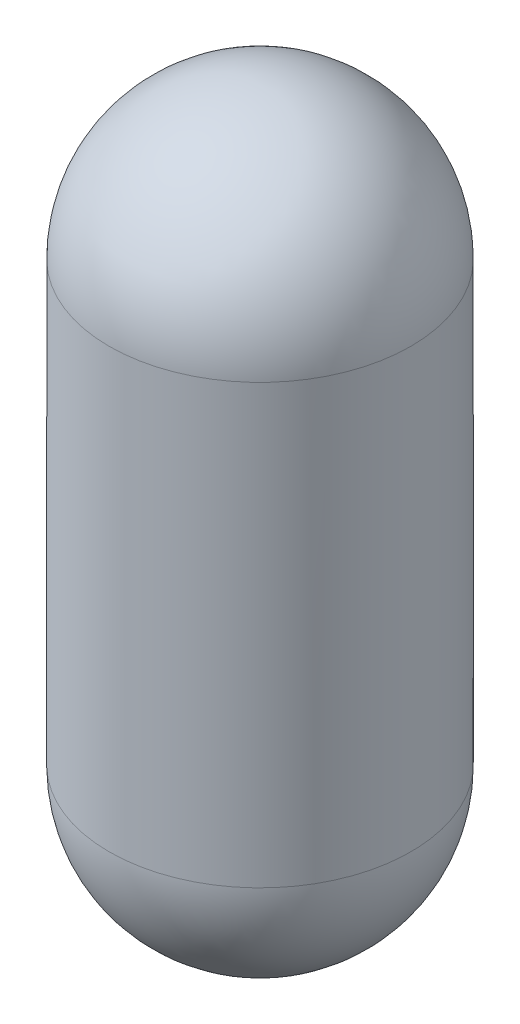
ISO-10303-21;
HEADER;
FILE_DESCRIPTION(('STEP AP214'),'2;1');
FILE_NAME('part.step','',(''),(''),'','','');
FILE_SCHEMA(('AUTOMOTIVE_DESIGN { 1 0 10303 214 1 1 1 1 }'));
ENDSEC;
DATA;
#1=APPLICATION_CONTEXT('core data for automotive mechanical design processes');
#2=APPLICATION_PROTOCOL_DEFINITION('international standard','automotive_design',2000,#1);
#3=PRODUCT_CONTEXT('',#1,'mechanical');
#4=PRODUCT('Part','Part','',(#3));
#5=PRODUCT_RELATED_PRODUCT_CATEGORY('part','',(#4));
#6=PRODUCT_DEFINITION_FORMATION('','',#4);
#7=PRODUCT_DEFINITION_CONTEXT('part definition',#1,'design');
#8=PRODUCT_DEFINITION('design','',#6,#7);
#9=PRODUCT_DEFINITION_SHAPE('','',#8);
#10=(LENGTH_UNIT() NAMED_UNIT(*) SI_UNIT(.MILLI.,.METRE.));
#11=(NAMED_UNIT(*) PLANE_ANGLE_UNIT() SI_UNIT($,.RADIAN.));
#12=(NAMED_UNIT(*) SI_UNIT($,.STERADIAN.) SOLID_ANGLE_UNIT());
#13=UNCERTAINTY_MEASURE_WITH_UNIT(LENGTH_MEASURE(1.E-05),#10,'distance_accuracy_value','');
#14=(GEOMETRIC_REPRESENTATION_CONTEXT(3) GLOBAL_UNCERTAINTY_ASSIGNED_CONTEXT((#13)) GLOBAL_UNIT_ASSIGNED_CONTEXT((#10,
#11,#12)) REPRESENTATION_CONTEXT('',''));
#15=CARTESIAN_POINT('',(0.,0.,0.));
#16=DIRECTION('',(0.,0.,1.));
#17=DIRECTION('',(1.,0.,0.));
#18=AXIS2_PLACEMENT_3D('',#15,#16,#17);
#19=CARTESIAN_POINT('',(0.,-2504.98315108804,0.));
#20=DIRECTION('',(0.,1.,0.));
#21=DIRECTION('',(-1.,0.,0.));
#22=AXIS2_PLACEMENT_3D('',#19,#20,#21);
#23=CYLINDRICAL_SURFACE('',#22,29.337);
#24=CARTESIAN_POINT('',(0.,-2504.98315108804,0.));
#25=DIRECTION('',(0.,-1.,0.));
#26=DIRECTION('',(1.,0.,0.));
#27=AXIS2_PLACEMENT_3D('',#24,#25,#26);
#28=CIRCLE('',#27,29.337);
#29=CARTESIAN_POINT('',(29.337,-2504.98315108804,0.));
#30=VERTEX_POINT('',#29);
#31=EDGE_CURVE('E57',#30,#30,#28,.T.);
#32=ORIENTED_EDGE('',*,*,#31,.F.);
#33=EDGE_LOOP('',(#32));
#34=FACE_BOUND('',#33,.T.);
#35=CARTESIAN_POINT('',(0.,-2503.39565108804,0.));
#36=DIRECTION('',(0.,-1.,0.));
#37=DIRECTION('',(1.,0.,0.));
#38=AXIS2_PLACEMENT_3D('',#35,#36,#37);
#39=CIRCLE('',#38,29.337);
#40=CARTESIAN_POINT('',(29.337,-2503.39565108804,0.));
#41=VERTEX_POINT('',#40);
#42=EDGE_CURVE('E61',#41,#41,#39,.T.);
#43=ORIENTED_EDGE('',*,*,#42,.T.);
#44=EDGE_LOOP('',(#43));
#45=FACE_BOUND('',#44,.T.);
#46=ADVANCED_FACE('F49',(#34,#45),#23,.T.);
#47=CARTESIAN_POINT('',(0.,-2504.98315108804,0.));
#48=DIRECTION('',(0.,-1.,0.));
#49=DIRECTION('',(1.,0.,0.));
#50=AXIS2_PLACEMENT_3D('',#47,#48,#49);
#51=PLANE('',#50);
#52=CARTESIAN_POINT('',(0.,-2504.98315108804,0.));
#53=DIRECTION('',(0.,-1.,0.));
#54=DIRECTION('',(1.,0.,0.));
#55=AXIS2_PLACEMENT_3D('',#52,#53,#54);
#56=CIRCLE('',#55,17.526);
#57=CARTESIAN_POINT('',(17.526,-2504.98315108804,0.));
#58=VERTEX_POINT('',#57);
#59=EDGE_CURVE('E78',#58,#58,#56,.T.);
#60=ORIENTED_EDGE('',*,*,#59,.F.);
#61=EDGE_LOOP('',(#60));
#62=FACE_BOUND('',#61,.T.);
#63=ORIENTED_EDGE('',*,*,#31,.T.);
#64=EDGE_LOOP('',(#63));
#65=FACE_BOUND('',#64,.T.);
#66=ADVANCED_FACE('F126',(#62,#65),#51,.T.);
#67=CARTESIAN_POINT('',(0.,-2323.21651797069,0.));
#68=DIRECTION('',(0.,-1.,0.));
#69=DIRECTION('',(1.,0.,0.));
#70=AXIS2_PLACEMENT_3D('',#67,#68,#69);
#71=CYLINDRICAL_SURFACE('',#70,58.674);
#72=CARTESIAN_POINT('',(0.,-2489.17165108804,0.));
#73=DIRECTION('',(0.,-1.,0.));
#74=DIRECTION('',(1.,0.,0.));
#75=AXIS2_PLACEMENT_3D('',#72,#73,#74);
#76=CIRCLE('',#75,58.674);
#77=CARTESIAN_POINT('',(58.674,-2489.17165108804,0.));
#78=VERTEX_POINT('',#77);
#79=EDGE_CURVE('E66',#78,#78,#76,.F.);
#80=ORIENTED_EDGE('',*,*,#79,.F.);
#81=EDGE_LOOP('',(#80));
#82=FACE_BOUND('',#81,.T.);
#83=CARTESIAN_POINT('',(0.,-2503.39565108804,0.));
#84=DIRECTION('',(0.,-1.,0.));
#85=DIRECTION('',(1.,0.,0.));
#86=AXIS2_PLACEMENT_3D('',#83,#84,#85);
#87=CIRCLE('',#86,58.674);
#88=CARTESIAN_POINT('',(58.674,-2503.39565108804,0.));
#89=VERTEX_POINT('',#88);
#90=EDGE_CURVE('E69',#89,#89,#87,.T.);
#91=ORIENTED_EDGE('',*,*,#90,.F.);
#92=EDGE_LOOP('',(#91));
#93=FACE_BOUND('',#92,.T.);
#94=ADVANCED_FACE('F113',(#82,#93),#71,.T.);
#95=CARTESIAN_POINT('',(0.,-2503.39565108804,0.));
#96=DIRECTION('',(0.,-1.,0.));
#97=DIRECTION('',(1.,0.,0.));
#98=AXIS2_PLACEMENT_3D('',#95,#96,#97);
#99=PLANE('',#98);
#100=CARTESIAN_POINT('',(31.4308964237425,-2503.39565108804,-31.4308964237417));
#101=DIRECTION('',(0.,-1.,0.));
#102=DIRECTION('',(0.,0.,-1.));
#103=AXIS2_PLACEMENT_3D('',#100,#101,#102);
#104=CIRCLE('',#103,7.87400000000002);
#105=CARTESIAN_POINT('',(31.4308964237426,-2503.39565108804,-39.3048964237418));
#106=VERTEX_POINT('',#105);
#107=EDGE_CURVE('E102',#106,#106,#104,.T.);
#108=ORIENTED_EDGE('',*,*,#107,.F.);
#109=EDGE_LOOP('',(#108));
#110=FACE_BOUND('',#109,.T.);
#111=CARTESIAN_POINT('',(-31.4308964237416,-2503.39565108804,-31.4308964237426));
#112=DIRECTION('',(0.,-1.,0.));
#113=DIRECTION('',(-1.,0.,0.));
#114=AXIS2_PLACEMENT_3D('',#111,#112,#113);
#115=CIRCLE('',#114,7.87400000000002);
#116=CARTESIAN_POINT('',(-39.3048964237416,-2503.39565108804,-31.4308964237427));
#117=VERTEX_POINT('',#116);
#118=EDGE_CURVE('E96',#117,#117,#115,.T.);
#119=ORIENTED_EDGE('',*,*,#118,.F.);
#120=EDGE_LOOP('',(#119));
#121=FACE_BOUND('',#120,.T.);
#122=CARTESIAN_POINT('',(-31.4308964237423,-2503.39565108804,31.4308964237417));
#123=DIRECTION('',(0.,-1.,0.));
#124=DIRECTION('',(0.,0.,1.));
#125=AXIS2_PLACEMENT_3D('',#122,#123,#124);
#126=CIRCLE('',#125,7.87400000000002);
#127=CARTESIAN_POINT('',(-31.4308964237423,-2503.39565108804,39.3048964237418));
#128=VERTEX_POINT('',#127);
#129=EDGE_CURVE('E90',#128,#128,#126,.T.);
#130=ORIENTED_EDGE('',*,*,#129,.F.);
#131=EDGE_LOOP('',(#130));
#132=FACE_BOUND('',#131,.T.);
#133=CARTESIAN_POINT('',(31.4308964237419,-2503.39565108804,31.4308964237422));
#134=DIRECTION('',(0.,-1.,0.));
#135=DIRECTION('',(1.,0.,0.));
#136=AXIS2_PLACEMENT_3D('',#133,#134,#135);
#137=CIRCLE('',#136,7.87400000000002);
#138=CARTESIAN_POINT('',(39.3048964237419,-2503.39565108804,31.4308964237422));
#139=VERTEX_POINT('',#138);
#140=EDGE_CURVE('E84',#139,#139,#137,.T.);
#141=ORIENTED_EDGE('',*,*,#140,.F.);
#142=EDGE_LOOP('',(#141));
#143=FACE_BOUND('',#142,.T.);
#144=ORIENTED_EDGE('',*,*,#42,.F.);
#145=EDGE_LOOP('',(#144));
#146=FACE_BOUND('',#145,.T.);
#147=ORIENTED_EDGE('',*,*,#90,.T.);
#148=EDGE_LOOP('',(#147));
#149=FACE_BOUND('',#148,.T.);
#150=ADVANCED_FACE('F109',(#110,#121,#132,#143,#146,#149),#99,.T.);
#151=CARTESIAN_POINT('',(0.,-2489.17165108804,0.));
#152=DIRECTION('',(0.,-1.,0.));
#153=DIRECTION('',(1.,0.,0.));
#154=AXIS2_PLACEMENT_3D('',#151,#152,#153);
#155=PLANE('',#154);
#156=CARTESIAN_POINT('',(31.4308964237425,-2489.17165108804,-31.4308964237417));
#157=DIRECTION('',(0.,-1.,0.));
#158=DIRECTION('',(0.,0.,-1.));
#159=AXIS2_PLACEMENT_3D('',#156,#157,#158);
#160=CIRCLE('',#159,7.87400000000002);
#161=CARTESIAN_POINT('',(31.4308964237426,-2489.17165108804,-39.3048964237418));
#162=VERTEX_POINT('',#161);
#163=EDGE_CURVE('E99',#162,#162,#160,.T.);
#164=ORIENTED_EDGE('',*,*,#163,.T.);
#165=EDGE_LOOP('',(#164));
#166=FACE_BOUND('',#165,.T.);
#167=CARTESIAN_POINT('',(-31.4308964237416,-2489.17165108804,-31.4308964237426));
#168=DIRECTION('',(0.,-1.,0.));
#169=DIRECTION('',(-1.,0.,0.));
#170=AXIS2_PLACEMENT_3D('',#167,#168,#169);
#171=CIRCLE('',#170,7.87400000000002);
#172=CARTESIAN_POINT('',(-39.3048964237416,-2489.17165108804,-31.4308964237427));
#173=VERTEX_POINT('',#172);
#174=EDGE_CURVE('E93',#173,#173,#171,.T.);
#175=ORIENTED_EDGE('',*,*,#174,.T.);
#176=EDGE_LOOP('',(#175));
#177=FACE_BOUND('',#176,.T.);
#178=CARTESIAN_POINT('',(-31.4308964237423,-2489.17165108804,31.4308964237417));
#179=DIRECTION('',(0.,-1.,0.));
#180=DIRECTION('',(0.,0.,1.));
#181=AXIS2_PLACEMENT_3D('',#178,#179,#180);
#182=CIRCLE('',#181,7.87400000000002);
#183=CARTESIAN_POINT('',(-31.4308964237423,-2489.17165108804,39.3048964237418));
#184=VERTEX_POINT('',#183);
#185=EDGE_CURVE('E87',#184,#184,#182,.T.);
#186=ORIENTED_EDGE('',*,*,#185,.T.);
#187=EDGE_LOOP('',(#186));
#188=FACE_BOUND('',#187,.T.);
#189=CARTESIAN_POINT('',(31.4308964237419,-2489.17165108804,31.4308964237422));
#190=DIRECTION('',(0.,-1.,0.));
#191=DIRECTION('',(1.,0.,0.));
#192=AXIS2_PLACEMENT_3D('',#189,#190,#191);
#193=CIRCLE('',#192,7.87400000000002);
#194=CARTESIAN_POINT('',(39.3048964237419,-2489.17165108804,31.4308964237422));
#195=VERTEX_POINT('',#194);
#196=EDGE_CURVE('E53',#195,#195,#193,.T.);
#197=ORIENTED_EDGE('',*,*,#196,.T.);
#198=EDGE_LOOP('',(#197));
#199=FACE_BOUND('',#198,.T.);
#200=CARTESIAN_POINT('',(0.,-2489.17165108804,0.));
#201=DIRECTION('',(0.,1.,0.));
#202=DIRECTION('',(-1.,0.,0.));
#203=AXIS2_PLACEMENT_3D('',#200,#201,#202);
#204=CIRCLE('',#203,29.337);
#205=CARTESIAN_POINT('',(-27.2084584633789,-2489.17165108804,10.9708412187297));
#206=VERTEX_POINT('',#205);
#207=EDGE_CURVE('E72',#206,#206,#204,.T.);
#208=ORIENTED_EDGE('',*,*,#207,.F.);
#209=EDGE_LOOP('',(#208));
#210=FACE_BOUND('',#209,.T.);
#211=ORIENTED_EDGE('',*,*,#79,.T.);
#212=EDGE_LOOP('',(#211));
#213=FACE_BOUND('',#212,.T.);
#214=ADVANCED_FACE('F112',(#166,#177,#188,#199,#210,#213),#155,.F.);
#215=CARTESIAN_POINT('',(-15.8138415699493,-2461.57031775471,13.9417767447534));
#216=CARTESIAN_POINT('',(-27.2084584633789,-2489.17165108804,10.9708412187297));
#217=CARTESIAN_POINT('',(-43.6973950594558,-2461.57031775471,-17.6859063951456));
#218=CARTESIAN_POINT('',(-49.1501409008387,-2489.17165108804,-43.4460757080282));
#219=CARTESIAN_POINT('',(-12.0697119195571,-2461.57031775471,-45.569459884652));
#220=CARTESIAN_POINT('',(5.26677602591926,-2489.17165108804,-65.3877581454877));
#221=CARTESIAN_POINT('',(15.8138415699494,-2461.57031775471,-13.9417767447534));
#222=CARTESIAN_POINT('',(27.208458463379,-2489.17165108804,-10.9708412187297));
#223=CARTESIAN_POINT('',(43.6973950594558,-2461.57031775471,17.6859063951456));
#224=CARTESIAN_POINT('',(49.1501409008387,-2489.17165108804,43.4460757080282));
#225=CARTESIAN_POINT('',(12.0697119195571,-2461.57031775471,45.569459884652));
#226=CARTESIAN_POINT('',(-5.26677602591926,-2489.17165108804,65.3877581454877));
#227=CARTESIAN_POINT('',(-15.8138415699493,-2461.57031775471,13.9417767447534));
#228=CARTESIAN_POINT('',(-27.2084584633789,-2489.17165108804,10.9708412187297));
#229=(BOUNDED_SURFACE() B_SPLINE_SURFACE(3,1,((#215,#216),(#217,#218),(#219,#220),(#221,#222),
(#223,#224),(#225,#226),(#227,#228)),.UNSPECIFIED.,.T.,.F.,.F.) B_SPLINE_SURFACE_WITH_KNOTS((4,
3,4),(2,2),(0.,0.5,1.),(0.,1.),
.UNSPECIFIED.) GEOMETRIC_REPRESENTATION_ITEM() RATIONAL_B_SPLINE_SURFACE(((1.,1.),
(0.333333333333333,0.333333333333333),(0.333333333333333,0.333333333333333),(1.,1.),
(0.333333333333333,0.333333333333333),(0.333333333333333,0.333333333333333),(1.,1.))) REPRESENTATION_ITEM('') SURFACE());
#230=CARTESIAN_POINT('',(0.,-2461.57031775471,0.));
#231=DIRECTION('',(0.,1.,0.));
#232=DIRECTION('',(-1.,0.,0.));
#233=AXIS2_PLACEMENT_3D('',#230,#231,#232);
#234=CIRCLE('',#233,21.082);
#235=CARTESIAN_POINT('',(-15.8138415699493,-2461.57031775471,13.9417767447534));
#236=VERTEX_POINT('',#235);
#237=EDGE_CURVE('E75',#236,#236,#234,.T.);
#238=CARTESIAN_POINT('',(-15.8138415699493,-2461.57031775471,13.9417767447534));
#239=CARTESIAN_POINT('',(-15.9325354959225,-2461.8578316436,13.9108294996907));
#240=CARTESIAN_POINT('',(-16.0512294218958,-2462.14534553249,13.8798822546279));
#241=CARTESIAN_POINT('',(-16.2886172738422,-2462.72037331027,13.8179877645024));
#242=CARTESIAN_POINT('',(-16.4073111998155,-2463.00788719915,13.7870405194396));
#243=CARTESIAN_POINT('',(-16.644699051762,-2463.58291497693,13.7251460293142));
#244=CARTESIAN_POINT('',(-16.7633929777352,-2463.87042886582,13.6941987842514));
#245=CARTESIAN_POINT('',(-17.0007808296816,-2464.4454566436,13.6323042941259));
#246=CARTESIAN_POINT('',(-17.1194747556548,-2464.73297053249,13.6013570490632));
#247=CARTESIAN_POINT('',(-17.3568626076013,-2465.30799831027,13.5394625589377));
#248=CARTESIAN_POINT('',(-17.4755565335745,-2465.59551219916,13.5085153138749));
#249=CARTESIAN_POINT('',(-17.7129443855209,-2466.17053997693,13.4466208237494));
#250=CARTESIAN_POINT('',(-17.8316383114941,-2466.45805386582,13.4156735786867));
#251=CARTESIAN_POINT('',(-18.0690261634406,-2467.0330816436,13.3537790885612));
#252=CARTESIAN_POINT('',(-18.1877200894139,-2467.32059553249,13.3228318434985));
#253=CARTESIAN_POINT('',(-18.4251079413603,-2467.89562331027,13.260937353373));
#254=CARTESIAN_POINT('',(-18.5438018673335,-2468.18313719916,13.2299901083102));
#255=CARTESIAN_POINT('',(-18.78118971928,-2468.75816497693,13.1680956181847));
#256=CARTESIAN_POINT('',(-18.8998836452532,-2469.04567886582,13.137148373122));
#257=CARTESIAN_POINT('',(-19.1372714971996,-2469.6207066436,13.0752538829965));
#258=CARTESIAN_POINT('',(-19.2559654231729,-2469.90822053249,13.0443066379337));
#259=CARTESIAN_POINT('',(-19.4933532751194,-2470.48324831027,12.9824121478082));
#260=CARTESIAN_POINT('',(-19.6120472010926,-2470.77076219916,12.9514649027455));
#261=CARTESIAN_POINT('',(-19.849435053039,-2471.34578997693,12.88957041262));
#262=CARTESIAN_POINT('',(-19.9681289790122,-2471.63330386582,12.8586231675573));
#263=CARTESIAN_POINT('',(-20.2055168309587,-2472.2083316436,12.7967286774318));
#264=CARTESIAN_POINT('',(-20.3242107569319,-2472.49584553249,12.765781432369));
#265=CARTESIAN_POINT('',(-20.5615986088784,-2473.07087331027,12.7038869422435));
#266=CARTESIAN_POINT('',(-20.6802925348516,-2473.35838719916,12.6729396971808));
#267=CARTESIAN_POINT('',(-20.917680386798,-2473.93341497693,12.6110452070553));
#268=CARTESIAN_POINT('',(-21.0363743127712,-2474.22092886582,12.5800979619925));
#269=CARTESIAN_POINT('',(-21.2737621647177,-2474.7959566436,12.5182034718671));
#270=CARTESIAN_POINT('',(-21.3924560906909,-2475.08347053249,12.4872562268043));
#271=CARTESIAN_POINT('',(-21.6298439426374,-2475.65849831027,12.4253617366788));
#272=CARTESIAN_POINT('',(-21.7485378686106,-2475.94601219916,12.394414491616));
#273=CARTESIAN_POINT('',(-21.9859257205571,-2476.52103997693,12.3325200014906));
#274=CARTESIAN_POINT('',(-22.1046196465303,-2476.80855386582,12.3015727564278));
#275=CARTESIAN_POINT('',(-22.3420074984767,-2477.3835816436,12.2396782663023));
#276=CARTESIAN_POINT('',(-22.46070142445,-2477.67109553249,12.2087310212396));
#277=CARTESIAN_POINT('',(-22.6980892763964,-2478.24612331027,12.1468365311141));
#278=CARTESIAN_POINT('',(-22.8167832023696,-2478.53363719916,12.1158892860513));
#279=CARTESIAN_POINT('',(-23.0541710543161,-2479.10866497693,12.0539947959258));
#280=CARTESIAN_POINT('',(-23.1728649802893,-2479.39617886582,12.0230475508631));
#281=CARTESIAN_POINT('',(-23.4102528322357,-2479.9712066436,11.9611530607376));
#282=CARTESIAN_POINT('',(-23.5289467582089,-2480.25872053249,11.9302058156749));
#283=CARTESIAN_POINT('',(-23.7663346101554,-2480.83374831027,11.8683113255494));
#284=CARTESIAN_POINT('',(-23.8850285361287,-2481.12126219916,11.8373640804866));
#285=CARTESIAN_POINT('',(-24.1224163880751,-2481.69628997693,11.7754695903611));
#286=CARTESIAN_POINT('',(-24.2411103140483,-2481.98380386582,11.7445223452984));
#287=CARTESIAN_POINT('',(-24.4784981659948,-2482.5588316436,11.6826278551729));
#288=CARTESIAN_POINT('',(-24.597192091968,-2482.84634553249,11.6516806101101));
#289=CARTESIAN_POINT('',(-24.8345799439144,-2483.42137331027,11.5897861199846));
#290=CARTESIAN_POINT('',(-24.9532738698877,-2483.70888719916,11.5588388749219));
#291=CARTESIAN_POINT('',(-25.1906617218342,-2484.28391497693,11.4969443847964));
#292=CARTESIAN_POINT('',(-25.3093556478073,-2484.57142886582,11.4659971397337));
#293=CARTESIAN_POINT('',(-25.5467434997537,-2485.1464566436,11.4041026496082));
#294=CARTESIAN_POINT('',(-25.665437425727,-2485.43397053249,11.3731554045454));
#295=CARTESIAN_POINT('',(-25.9028252776735,-2486.00899831027,11.3112609144199));
#296=CARTESIAN_POINT('',(-26.0215192036467,-2486.29651219916,11.2803136693572));
#297=CARTESIAN_POINT('',(-26.2589070555931,-2486.87153997693,11.2184191792317));
#298=CARTESIAN_POINT('',(-26.3776009815663,-2487.15905386582,11.1874719341689));
#299=CARTESIAN_POINT('',(-26.6149888335128,-2487.7340816436,11.1255774440434));
#300=CARTESIAN_POINT('',(-26.7336827594861,-2488.02159553249,11.0946301989807));
#301=CARTESIAN_POINT('',(-26.9710706114326,-2488.59662331027,11.0327357088552));
#302=CARTESIAN_POINT('',(-27.0897645374058,-2488.88413719916,11.0017884637924));
#303=CARTESIAN_POINT('',(-27.2084584633789,-2489.17165108804,10.9708412187297));
#304=B_SPLINE_CURVE_WITH_KNOTS('',3,(#238,#239,#240,#241,#242,#243,#244,#245,#246,#247,#248,
#249,#250,#251,#252,#253,#254,#255,#256,#257,#258,#259,#260,#261,#262,#263,#264,#265,#266,#267,
#268,#269,#270,#271,#272,#273,#274,#275,#276,#277,#278,#279,#280,#281,#282,#283,#284,#285,#286,
#287,#288,#289,#290,#291,#292,#293,#294,#295,#296,#297,#298,#299,#300,#301,#302,#303),
.UNSPECIFIED.,.F.,.F.,(4,2,2,2,2,2,2,2,2,2,2,2,2,2,2,2,2,2,2,2,2,2,2,2,2,2,2,2,2,2,2,2,4),(0.,
0.937759002673657,1.87551800534691,2.81327700802056,3.75103601069422,4.68879501336788,
5.62655401604154,6.56431301871478,7.50207202138844,8.4398310240621,9.37759002673535,
10.315349029409,11.2531080320827,12.1908670347563,13.12862603743,14.0663850401036,
15.0041440427769,15.9419030454501,16.8796620481238,17.8174210507974,18.7551800534711,
19.6929390561448,20.6306980588184,21.5684570614917,22.5062160641653,23.443975066839,
24.3817340695122,25.3194930721863,26.2572520748595,27.1950110775332,28.1327700802069,
29.0705290828801,30.0082880855538),.UNSPECIFIED.);
#305=EDGE_CURVE('BSEAM165',#236,#206,#304,.T.);
#306=ORIENTED_EDGE('',*,*,#237,.F.);
#307=ORIENTED_EDGE('',*,*,#207,.T.);
#308=ORIENTED_EDGE('',*,*,#305,.T.);
#309=ORIENTED_EDGE('',*,*,#305,.F.);
#310=EDGE_LOOP('',(#306,#308,#307,#309));
#311=FACE_BOUND('',#310,.T.);
#312=ADVANCED_FACE('F165',(#311),#229,.T.);
#313=CARTESIAN_POINT('',(0.,-2388.14075044414,0.));
#314=DIRECTION('',(0.,-1.,0.));
#315=DIRECTION('',(1.,0.,0.));
#316=AXIS2_PLACEMENT_3D('',#313,#314,#315);
#317=CYLINDRICAL_SURFACE('',#316,21.082);
#318=CARTESIAN_POINT('',(0.,-2451.32565108804,0.));
#319=DIRECTION('',(0.,-1.,0.));
#320=DIRECTION('',(1.,0.,0.));
#321=AXIS2_PLACEMENT_3D('',#318,#319,#320);
#322=CIRCLE('',#321,21.082);
#323=CARTESIAN_POINT('',(21.082,-2451.32565108804,0.));
#324=VERTEX_POINT('',#323);
#325=EDGE_CURVE('E11',#324,#324,#322,.T.);
#326=ORIENTED_EDGE('',*,*,#325,.T.);
#327=EDGE_LOOP('',(#326));
#328=FACE_BOUND('',#327,.T.);
#329=ORIENTED_EDGE('',*,*,#237,.T.);
#330=EDGE_LOOP('',(#329));
#331=FACE_BOUND('',#330,.T.);
#332=ADVANCED_FACE('F175',(#328,#331),#317,.T.);
#333=CARTESIAN_POINT('',(0.,-2451.32565108804,0.));
#334=DIRECTION('',(0.,-1.,0.));
#335=DIRECTION('',(1.,0.,0.));
#336=AXIS2_PLACEMENT_3D('',#333,#334,#335);
#337=CONICAL_SURFACE('',#336,21.082,0.785398163397443);
#338=CARTESIAN_POINT('',(0.,-2447.76965108804,0.));
#339=DIRECTION('',(0.,-1.,0.));
#340=DIRECTION('',(1.,0.,0.));
#341=AXIS2_PLACEMENT_3D('',#338,#339,#340);
#342=CIRCLE('',#341,17.526);
#343=CARTESIAN_POINT('',(17.526,-2447.76965108804,0.));
#344=VERTEX_POINT('',#343);
#345=EDGE_CURVE('E81',#344,#344,#342,.T.);
#346=ORIENTED_EDGE('',*,*,#345,.T.);
#347=EDGE_LOOP('',(#346));
#348=FACE_BOUND('',#347,.T.);
#349=ORIENTED_EDGE('',*,*,#325,.F.);
#350=EDGE_LOOP('',(#349));
#351=FACE_BOUND('',#350,.T.);
#352=ADVANCED_FACE('F51',(#348,#351),#337,.T.);
#353=CARTESIAN_POINT('',(0.,-2504.98415108804,0.));
#354=DIRECTION('',(0.,1.,0.));
#355=DIRECTION('',(-1.,0.,0.));
#356=AXIS2_PLACEMENT_3D('',#353,#354,#355);
#357=CYLINDRICAL_SURFACE('',#356,17.526);
#358=ORIENTED_EDGE('',*,*,#59,.T.);
#359=EDGE_LOOP('',(#358));
#360=FACE_BOUND('',#359,.T.);
#361=ORIENTED_EDGE('',*,*,#345,.F.);
#362=EDGE_LOOP('',(#361));
#363=FACE_BOUND('',#362,.T.);
#364=ADVANCED_FACE('F193',(#360,#363),#357,.F.);
#365=CARTESIAN_POINT('',(31.4308964237419,-2447.76965108804,31.4308964237422));
#366=DIRECTION('',(0.,-1.,0.));
#367=DIRECTION('',(1.,0.,0.));
#368=AXIS2_PLACEMENT_3D('',#365,#366,#367);
#369=CYLINDRICAL_SURFACE('',#368,7.87400000000002);
#370=CARTESIAN_POINT('',(39.3048964237419,-2503.39565108804,31.4308964237422));
#371=CARTESIAN_POINT('',(39.3048964237419,-2503.24748442138,31.4308964237422));
#372=CARTESIAN_POINT('',(39.3048964237419,-2503.09931775471,31.4308964237422));
#373=CARTESIAN_POINT('',(39.3048964237419,-2502.80298442138,31.4308964237422));
#374=CARTESIAN_POINT('',(39.3048964237419,-2502.65481775471,31.4308964237422));
#375=CARTESIAN_POINT('',(39.3048964237419,-2502.35848442138,31.4308964237422));
#376=CARTESIAN_POINT('',(39.3048964237419,-2502.21031775471,31.4308964237422));
#377=CARTESIAN_POINT('',(39.3048964237419,-2501.91398442138,31.4308964237422));
#378=CARTESIAN_POINT('',(39.3048964237419,-2501.76581775471,31.4308964237422));
#379=CARTESIAN_POINT('',(39.3048964237419,-2501.46948442138,31.4308964237422));
#380=CARTESIAN_POINT('',(39.3048964237419,-2501.32131775471,31.4308964237422));
#381=CARTESIAN_POINT('',(39.3048964237419,-2501.02498442138,31.4308964237422));
#382=CARTESIAN_POINT('',(39.3048964237419,-2500.87681775471,31.4308964237422));
#383=CARTESIAN_POINT('',(39.3048964237419,-2500.58048442138,31.4308964237422));
#384=CARTESIAN_POINT('',(39.3048964237419,-2500.43231775471,31.4308964237422));
#385=CARTESIAN_POINT('',(39.3048964237419,-2500.13598442138,31.4308964237422));
#386=CARTESIAN_POINT('',(39.3048964237419,-2499.98781775471,31.4308964237422));
#387=CARTESIAN_POINT('',(39.3048964237419,-2499.69148442138,31.4308964237422));
#388=CARTESIAN_POINT('',(39.3048964237419,-2499.54331775471,31.4308964237422));
#389=CARTESIAN_POINT('',(39.3048964237419,-2499.24698442138,31.4308964237422));
#390=CARTESIAN_POINT('',(39.3048964237419,-2499.09881775471,31.4308964237422));
#391=CARTESIAN_POINT('',(39.3048964237419,-2498.80248442138,31.4308964237422));
#392=CARTESIAN_POINT('',(39.3048964237419,-2498.65431775471,31.4308964237422));
#393=CARTESIAN_POINT('',(39.3048964237419,-2498.35798442138,31.4308964237422));
#394=CARTESIAN_POINT('',(39.3048964237419,-2498.20981775471,31.4308964237422));
#395=CARTESIAN_POINT('',(39.3048964237419,-2497.91348442138,31.4308964237422));
#396=CARTESIAN_POINT('',(39.3048964237419,-2497.76531775471,31.4308964237422));
#397=CARTESIAN_POINT('',(39.3048964237419,-2497.46898442138,31.4308964237422));
#398=CARTESIAN_POINT('',(39.3048964237419,-2497.32081775471,31.4308964237422));
#399=CARTESIAN_POINT('',(39.3048964237419,-2497.02448442138,31.4308964237422));
#400=CARTESIAN_POINT('',(39.3048964237419,-2496.87631775471,31.4308964237422));
#401=CARTESIAN_POINT('',(39.3048964237419,-2496.57998442138,31.4308964237422));
#402=CARTESIAN_POINT('',(39.3048964237419,-2496.43181775471,31.4308964237422));
#403=CARTESIAN_POINT('',(39.3048964237419,-2496.13548442138,31.4308964237422));
#404=CARTESIAN_POINT('',(39.3048964237419,-2495.98731775471,31.4308964237422));
#405=CARTESIAN_POINT('',(39.3048964237419,-2495.69098442138,31.4308964237422));
#406=CARTESIAN_POINT('',(39.3048964237419,-2495.54281775471,31.4308964237422));
#407=CARTESIAN_POINT('',(39.3048964237419,-2495.24648442138,31.4308964237422));
#408=CARTESIAN_POINT('',(39.3048964237419,-2495.09831775471,31.4308964237422));
#409=CARTESIAN_POINT('',(39.3048964237419,-2494.80198442138,31.4308964237422));
#410=CARTESIAN_POINT('',(39.3048964237419,-2494.65381775471,31.4308964237422));
#411=CARTESIAN_POINT('',(39.3048964237419,-2494.35748442138,31.4308964237422));
#412=CARTESIAN_POINT('',(39.3048964237419,-2494.20931775471,31.4308964237422));
#413=CARTESIAN_POINT('',(39.3048964237419,-2493.91298442138,31.4308964237422));
#414=CARTESIAN_POINT('',(39.3048964237419,-2493.76481775471,31.4308964237422));
#415=CARTESIAN_POINT('',(39.3048964237419,-2493.46848442138,31.4308964237422));
#416=CARTESIAN_POINT('',(39.3048964237419,-2493.32031775471,31.4308964237422));
#417=CARTESIAN_POINT('',(39.3048964237419,-2493.02398442138,31.4308964237422));
#418=CARTESIAN_POINT('',(39.3048964237419,-2492.87581775471,31.4308964237422));
#419=CARTESIAN_POINT('',(39.3048964237419,-2492.57948442138,31.4308964237422));
#420=CARTESIAN_POINT('',(39.3048964237419,-2492.43131775471,31.4308964237422));
#421=CARTESIAN_POINT('',(39.3048964237419,-2492.13498442138,31.4308964237422));
#422=CARTESIAN_POINT('',(39.3048964237419,-2491.98681775471,31.4308964237422));
#423=CARTESIAN_POINT('',(39.3048964237419,-2491.69048442138,31.4308964237422));
#424=CARTESIAN_POINT('',(39.3048964237419,-2491.54231775471,31.4308964237422));
#425=CARTESIAN_POINT('',(39.3048964237419,-2491.24598442138,31.4308964237422));
#426=CARTESIAN_POINT('',(39.3048964237419,-2491.09781775471,31.4308964237422));
#427=CARTESIAN_POINT('',(39.3048964237419,-2490.80148442138,31.4308964237422));
#428=CARTESIAN_POINT('',(39.3048964237419,-2490.65331775471,31.4308964237422));
#429=CARTESIAN_POINT('',(39.3048964237419,-2490.35698442138,31.4308964237422));
#430=CARTESIAN_POINT('',(39.3048964237419,-2490.20881775471,31.4308964237422));
#431=CARTESIAN_POINT('',(39.3048964237419,-2489.91248442138,31.4308964237422));
#432=CARTESIAN_POINT('',(39.3048964237419,-2489.76431775471,31.4308964237422));
#433=CARTESIAN_POINT('',(39.3048964237419,-2489.46798442138,31.4308964237422));
#434=CARTESIAN_POINT('',(39.3048964237419,-2489.31981775471,31.4308964237422));
#435=CARTESIAN_POINT('',(39.3048964237419,-2489.17165108804,31.4308964237422));
#436=B_SPLINE_CURVE_WITH_KNOTS('',3,(#370,#371,#372,#373,#374,#375,#376,#377,#378,#379,#380,
#381,#382,#383,#384,#385,#386,#387,#388,#389,#390,#391,#392,#393,#394,#395,#396,#397,#398,#399,
#400,#401,#402,#403,#404,#405,#406,#407,#408,#409,#410,#411,#412,#413,#414,#415,#416,#417,#418,
#419,#420,#421,#422,#423,#424,#425,#426,#427,#428,#429,#430,#431,#432,#433,#434,#435),
.UNSPECIFIED.,.F.,.F.,(4,2,2,2,2,2,2,2,2,2,2,2,2,2,2,2,2,2,2,2,2,2,2,2,2,2,2,2,2,2,2,2,4),(0.,
0.444499999999959,0.888999999999918,1.33349999999988,1.77799999999984,2.22249999999979,
2.66699999999975,3.11149999999971,3.55599999999967,4.00049999999963,4.44499999999959,
4.88949999999999,5.33399999999995,5.77849999999991,6.22299999999987,6.66749999999983,
7.11199999999979,7.55649999999974,8.0009999999997,8.44549999999966,8.88999999999962,
9.33449999999958,9.77899999999998,10.2234999999999,10.6679999999999,11.1124999999999,
11.5569999999998,12.0014999999998,12.4459999999997,12.8904999999997,13.3349999999997,
13.7794999999996,14.2239999999996),.UNSPECIFIED.);
#437=EDGE_CURVE('BSEAM202',#139,#195,#436,.T.);
#438=ORIENTED_EDGE('',*,*,#140,.T.);
#439=ORIENTED_EDGE('',*,*,#196,.F.);
#440=ORIENTED_EDGE('',*,*,#437,.T.);
#441=ORIENTED_EDGE('',*,*,#437,.F.);
#442=EDGE_LOOP('',(#438,#440,#439,#441));
#443=FACE_BOUND('',#442,.T.);
#444=ADVANCED_FACE('F202',(#443),#369,.F.);
#445=CARTESIAN_POINT('',(-31.4308964237423,-2447.76965108804,31.4308964237417));
#446=DIRECTION('',(0.,-1.,0.));
#447=DIRECTION('',(0.,0.,1.));
#448=AXIS2_PLACEMENT_3D('',#445,#446,#447);
#449=CYLINDRICAL_SURFACE('',#448,7.87400000000002);
#450=CARTESIAN_POINT('',(-31.4308964237423,-2503.39565108804,39.3048964237418));
#451=CARTESIAN_POINT('',(-31.4308964237423,-2503.24748442138,39.3048964237418));
#452=CARTESIAN_POINT('',(-31.4308964237423,-2503.09931775471,39.3048964237418));
#453=CARTESIAN_POINT('',(-31.4308964237423,-2502.80298442138,39.3048964237418));
#454=CARTESIAN_POINT('',(-31.4308964237423,-2502.65481775471,39.3048964237418));
#455=CARTESIAN_POINT('',(-31.4308964237423,-2502.35848442138,39.3048964237418));
#456=CARTESIAN_POINT('',(-31.4308964237423,-2502.21031775471,39.3048964237418));
#457=CARTESIAN_POINT('',(-31.4308964237423,-2501.91398442138,39.3048964237418));
#458=CARTESIAN_POINT('',(-31.4308964237423,-2501.76581775471,39.3048964237418));
#459=CARTESIAN_POINT('',(-31.4308964237423,-2501.46948442138,39.3048964237418));
#460=CARTESIAN_POINT('',(-31.4308964237423,-2501.32131775471,39.3048964237418));
#461=CARTESIAN_POINT('',(-31.4308964237423,-2501.02498442138,39.3048964237418));
#462=CARTESIAN_POINT('',(-31.4308964237423,-2500.87681775471,39.3048964237418));
#463=CARTESIAN_POINT('',(-31.4308964237423,-2500.58048442138,39.3048964237418));
#464=CARTESIAN_POINT('',(-31.4308964237423,-2500.43231775471,39.3048964237418));
#465=CARTESIAN_POINT('',(-31.4308964237423,-2500.13598442138,39.3048964237418));
#466=CARTESIAN_POINT('',(-31.4308964237423,-2499.98781775471,39.3048964237418));
#467=CARTESIAN_POINT('',(-31.4308964237423,-2499.69148442138,39.3048964237418));
#468=CARTESIAN_POINT('',(-31.4308964237423,-2499.54331775471,39.3048964237418));
#469=CARTESIAN_POINT('',(-31.4308964237423,-2499.24698442138,39.3048964237418));
#470=CARTESIAN_POINT('',(-31.4308964237423,-2499.09881775471,39.3048964237418));
#471=CARTESIAN_POINT('',(-31.4308964237423,-2498.80248442138,39.3048964237418));
#472=CARTESIAN_POINT('',(-31.4308964237423,-2498.65431775471,39.3048964237418));
#473=CARTESIAN_POINT('',(-31.4308964237423,-2498.35798442138,39.3048964237418));
#474=CARTESIAN_POINT('',(-31.4308964237423,-2498.20981775471,39.3048964237418));
#475=CARTESIAN_POINT('',(-31.4308964237423,-2497.91348442138,39.3048964237418));
#476=CARTESIAN_POINT('',(-31.4308964237423,-2497.76531775471,39.3048964237418));
#477=CARTESIAN_POINT('',(-31.4308964237423,-2497.46898442138,39.3048964237418));
#478=CARTESIAN_POINT('',(-31.4308964237423,-2497.32081775471,39.3048964237418));
#479=CARTESIAN_POINT('',(-31.4308964237423,-2497.02448442138,39.3048964237418));
#480=CARTESIAN_POINT('',(-31.4308964237423,-2496.87631775471,39.3048964237418));
#481=CARTESIAN_POINT('',(-31.4308964237423,-2496.57998442138,39.3048964237418));
#482=CARTESIAN_POINT('',(-31.4308964237423,-2496.43181775471,39.3048964237418));
#483=CARTESIAN_POINT('',(-31.4308964237423,-2496.13548442138,39.3048964237418));
#484=CARTESIAN_POINT('',(-31.4308964237423,-2495.98731775471,39.3048964237418));
#485=CARTESIAN_POINT('',(-31.4308964237423,-2495.69098442138,39.3048964237418));
#486=CARTESIAN_POINT('',(-31.4308964237423,-2495.54281775471,39.3048964237418));
#487=CARTESIAN_POINT('',(-31.4308964237423,-2495.24648442138,39.3048964237418));
#488=CARTESIAN_POINT('',(-31.4308964237423,-2495.09831775471,39.3048964237418));
#489=CARTESIAN_POINT('',(-31.4308964237423,-2494.80198442138,39.3048964237418));
#490=CARTESIAN_POINT('',(-31.4308964237423,-2494.65381775471,39.3048964237418));
#491=CARTESIAN_POINT('',(-31.4308964237423,-2494.35748442138,39.3048964237418));
#492=CARTESIAN_POINT('',(-31.4308964237423,-2494.20931775471,39.3048964237418));
#493=CARTESIAN_POINT('',(-31.4308964237423,-2493.91298442138,39.3048964237418));
#494=CARTESIAN_POINT('',(-31.4308964237423,-2493.76481775471,39.3048964237418));
#495=CARTESIAN_POINT('',(-31.4308964237423,-2493.46848442138,39.3048964237418));
#496=CARTESIAN_POINT('',(-31.4308964237423,-2493.32031775471,39.3048964237418));
#497=CARTESIAN_POINT('',(-31.4308964237423,-2493.02398442138,39.3048964237418));
#498=CARTESIAN_POINT('',(-31.4308964237423,-2492.87581775471,39.3048964237418));
#499=CARTESIAN_POINT('',(-31.4308964237423,-2492.57948442138,39.3048964237418));
#500=CARTESIAN_POINT('',(-31.4308964237423,-2492.43131775471,39.3048964237418));
#501=CARTESIAN_POINT('',(-31.4308964237423,-2492.13498442138,39.3048964237418));
#502=CARTESIAN_POINT('',(-31.4308964237423,-2491.98681775471,39.3048964237418));
#503=CARTESIAN_POINT('',(-31.4308964237423,-2491.69048442138,39.3048964237418));
#504=CARTESIAN_POINT('',(-31.4308964237423,-2491.54231775471,39.3048964237418));
#505=CARTESIAN_POINT('',(-31.4308964237423,-2491.24598442138,39.3048964237418));
#506=CARTESIAN_POINT('',(-31.4308964237423,-2491.09781775471,39.3048964237418));
#507=CARTESIAN_POINT('',(-31.4308964237423,-2490.80148442138,39.3048964237418));
#508=CARTESIAN_POINT('',(-31.4308964237423,-2490.65331775471,39.3048964237418));
#509=CARTESIAN_POINT('',(-31.4308964237423,-2490.35698442138,39.3048964237418));
#510=CARTESIAN_POINT('',(-31.4308964237423,-2490.20881775471,39.3048964237418));
#511=CARTESIAN_POINT('',(-31.4308964237423,-2489.91248442138,39.3048964237418));
#512=CARTESIAN_POINT('',(-31.4308964237423,-2489.76431775471,39.3048964237418));
#513=CARTESIAN_POINT('',(-31.4308964237423,-2489.46798442138,39.3048964237418));
#514=CARTESIAN_POINT('',(-31.4308964237423,-2489.31981775471,39.3048964237418));
#515=CARTESIAN_POINT('',(-31.4308964237423,-2489.17165108804,39.3048964237418));
#516=B_SPLINE_CURVE_WITH_KNOTS('',3,(#450,#451,#452,#453,#454,#455,#456,#457,#458,#459,#460,
#461,#462,#463,#464,#465,#466,#467,#468,#469,#470,#471,#472,#473,#474,#475,#476,#477,#478,#479,
#480,#481,#482,#483,#484,#485,#486,#487,#488,#489,#490,#491,#492,#493,#494,#495,#496,#497,#498,
#499,#500,#501,#502,#503,#504,#505,#506,#507,#508,#509,#510,#511,#512,#513,#514,#515),
.UNSPECIFIED.,.F.,.F.,(4,2,2,2,2,2,2,2,2,2,2,2,2,2,2,2,2,2,2,2,2,2,2,2,2,2,2,2,2,2,2,2,4),(0.,
0.444499999999959,0.888999999999918,1.33349999999988,1.77799999999984,2.22249999999979,
2.66699999999975,3.11149999999971,3.55599999999967,4.00049999999963,4.44499999999959,
4.88949999999999,5.33399999999995,5.77849999999991,6.22299999999987,6.66749999999983,
7.11199999999979,7.55649999999974,8.0009999999997,8.44549999999966,8.88999999999962,
9.33449999999958,9.77899999999998,10.2234999999999,10.6679999999999,11.1124999999999,
11.5569999999998,12.0014999999998,12.4459999999997,12.8904999999997,13.3349999999997,
13.7794999999996,14.2239999999996),.UNSPECIFIED.);
#517=EDGE_CURVE('BSEAM212',#128,#184,#516,.T.);
#518=ORIENTED_EDGE('',*,*,#129,.T.);
#519=ORIENTED_EDGE('',*,*,#185,.F.);
#520=ORIENTED_EDGE('',*,*,#517,.T.);
#521=ORIENTED_EDGE('',*,*,#517,.F.);
#522=EDGE_LOOP('',(#518,#520,#519,#521));
#523=FACE_BOUND('',#522,.T.);
#524=ADVANCED_FACE('F212',(#523),#449,.F.);
#525=CARTESIAN_POINT('',(-31.4308964237416,-2447.76965108804,-31.4308964237426));
#526=DIRECTION('',(0.,-1.,0.));
#527=DIRECTION('',(-1.,0.,0.));
#528=AXIS2_PLACEMENT_3D('',#525,#526,#527);
#529=CYLINDRICAL_SURFACE('',#528,7.87400000000002);
#530=CARTESIAN_POINT('',(-39.3048964237416,-2503.39565108804,-31.4308964237427));
#531=CARTESIAN_POINT('',(-39.3048964237416,-2503.24748442138,-31.4308964237427));
#532=CARTESIAN_POINT('',(-39.3048964237416,-2503.09931775471,-31.4308964237427));
#533=CARTESIAN_POINT('',(-39.3048964237416,-2502.80298442138,-31.4308964237427));
#534=CARTESIAN_POINT('',(-39.3048964237416,-2502.65481775471,-31.4308964237427));
#535=CARTESIAN_POINT('',(-39.3048964237416,-2502.35848442138,-31.4308964237427));
#536=CARTESIAN_POINT('',(-39.3048964237416,-2502.21031775471,-31.4308964237427));
#537=CARTESIAN_POINT('',(-39.3048964237416,-2501.91398442138,-31.4308964237427));
#538=CARTESIAN_POINT('',(-39.3048964237416,-2501.76581775471,-31.4308964237427));
#539=CARTESIAN_POINT('',(-39.3048964237416,-2501.46948442138,-31.4308964237427));
#540=CARTESIAN_POINT('',(-39.3048964237416,-2501.32131775471,-31.4308964237427));
#541=CARTESIAN_POINT('',(-39.3048964237416,-2501.02498442138,-31.4308964237427));
#542=CARTESIAN_POINT('',(-39.3048964237416,-2500.87681775471,-31.4308964237427));
#543=CARTESIAN_POINT('',(-39.3048964237416,-2500.58048442138,-31.4308964237427));
#544=CARTESIAN_POINT('',(-39.3048964237416,-2500.43231775471,-31.4308964237427));
#545=CARTESIAN_POINT('',(-39.3048964237416,-2500.13598442138,-31.4308964237427));
#546=CARTESIAN_POINT('',(-39.3048964237416,-2499.98781775471,-31.4308964237427));
#547=CARTESIAN_POINT('',(-39.3048964237416,-2499.69148442138,-31.4308964237427));
#548=CARTESIAN_POINT('',(-39.3048964237416,-2499.54331775471,-31.4308964237427));
#549=CARTESIAN_POINT('',(-39.3048964237416,-2499.24698442138,-31.4308964237427));
#550=CARTESIAN_POINT('',(-39.3048964237416,-2499.09881775471,-31.4308964237427));
#551=CARTESIAN_POINT('',(-39.3048964237416,-2498.80248442138,-31.4308964237427));
#552=CARTESIAN_POINT('',(-39.3048964237416,-2498.65431775471,-31.4308964237427));
#553=CARTESIAN_POINT('',(-39.3048964237416,-2498.35798442138,-31.4308964237427));
#554=CARTESIAN_POINT('',(-39.3048964237416,-2498.20981775471,-31.4308964237427));
#555=CARTESIAN_POINT('',(-39.3048964237416,-2497.91348442138,-31.4308964237427));
#556=CARTESIAN_POINT('',(-39.3048964237416,-2497.76531775471,-31.4308964237427));
#557=CARTESIAN_POINT('',(-39.3048964237416,-2497.46898442138,-31.4308964237427));
#558=CARTESIAN_POINT('',(-39.3048964237416,-2497.32081775471,-31.4308964237427));
#559=CARTESIAN_POINT('',(-39.3048964237416,-2497.02448442138,-31.4308964237427));
#560=CARTESIAN_POINT('',(-39.3048964237416,-2496.87631775471,-31.4308964237427));
#561=CARTESIAN_POINT('',(-39.3048964237416,-2496.57998442138,-31.4308964237427));
#562=CARTESIAN_POINT('',(-39.3048964237416,-2496.43181775471,-31.4308964237427));
#563=CARTESIAN_POINT('',(-39.3048964237416,-2496.13548442138,-31.4308964237427));
#564=CARTESIAN_POINT('',(-39.3048964237416,-2495.98731775471,-31.4308964237427));
#565=CARTESIAN_POINT('',(-39.3048964237416,-2495.69098442138,-31.4308964237427));
#566=CARTESIAN_POINT('',(-39.3048964237416,-2495.54281775471,-31.4308964237427));
#567=CARTESIAN_POINT('',(-39.3048964237416,-2495.24648442138,-31.4308964237427));
#568=CARTESIAN_POINT('',(-39.3048964237416,-2495.09831775471,-31.4308964237427));
#569=CARTESIAN_POINT('',(-39.3048964237416,-2494.80198442138,-31.4308964237427));
#570=CARTESIAN_POINT('',(-39.3048964237416,-2494.65381775471,-31.4308964237427));
#571=CARTESIAN_POINT('',(-39.3048964237416,-2494.35748442138,-31.4308964237427));
#572=CARTESIAN_POINT('',(-39.3048964237416,-2494.20931775471,-31.4308964237427));
#573=CARTESIAN_POINT('',(-39.3048964237416,-2493.91298442138,-31.4308964237427));
#574=CARTESIAN_POINT('',(-39.3048964237416,-2493.76481775471,-31.4308964237427));
#575=CARTESIAN_POINT('',(-39.3048964237416,-2493.46848442138,-31.4308964237427));
#576=CARTESIAN_POINT('',(-39.3048964237416,-2493.32031775471,-31.4308964237427));
#577=CARTESIAN_POINT('',(-39.3048964237416,-2493.02398442138,-31.4308964237427));
#578=CARTESIAN_POINT('',(-39.3048964237416,-2492.87581775471,-31.4308964237427));
#579=CARTESIAN_POINT('',(-39.3048964237416,-2492.57948442138,-31.4308964237427));
#580=CARTESIAN_POINT('',(-39.3048964237416,-2492.43131775471,-31.4308964237427));
#581=CARTESIAN_POINT('',(-39.3048964237416,-2492.13498442138,-31.4308964237427));
#582=CARTESIAN_POINT('',(-39.3048964237416,-2491.98681775471,-31.4308964237427));
#583=CARTESIAN_POINT('',(-39.3048964237416,-2491.69048442138,-31.4308964237427));
#584=CARTESIAN_POINT('',(-39.3048964237416,-2491.54231775471,-31.4308964237427));
#585=CARTESIAN_POINT('',(-39.3048964237416,-2491.24598442138,-31.4308964237427));
#586=CARTESIAN_POINT('',(-39.3048964237416,-2491.09781775471,-31.4308964237427));
#587=CARTESIAN_POINT('',(-39.3048964237416,-2490.80148442138,-31.4308964237427));
#588=CARTESIAN_POINT('',(-39.3048964237416,-2490.65331775471,-31.4308964237427));
#589=CARTESIAN_POINT('',(-39.3048964237416,-2490.35698442138,-31.4308964237427));
#590=CARTESIAN_POINT('',(-39.3048964237416,-2490.20881775471,-31.4308964237427));
#591=CARTESIAN_POINT('',(-39.3048964237416,-2489.91248442138,-31.4308964237427));
#592=CARTESIAN_POINT('',(-39.3048964237416,-2489.76431775471,-31.4308964237427));
#593=CARTESIAN_POINT('',(-39.3048964237416,-2489.46798442138,-31.4308964237427));
#594=CARTESIAN_POINT('',(-39.3048964237416,-2489.31981775471,-31.4308964237427));
#595=CARTESIAN_POINT('',(-39.3048964237416,-2489.17165108804,-31.4308964237427));
#596=B_SPLINE_CURVE_WITH_KNOTS('',3,(#530,#531,#532,#533,#534,#535,#536,#537,#538,#539,#540,
#541,#542,#543,#544,#545,#546,#547,#548,#549,#550,#551,#552,#553,#554,#555,#556,#557,#558,#559,
#560,#561,#562,#563,#564,#565,#566,#567,#568,#569,#570,#571,#572,#573,#574,#575,#576,#577,#578,
#579,#580,#581,#582,#583,#584,#585,#586,#587,#588,#589,#590,#591,#592,#593,#594,#595),
.UNSPECIFIED.,.F.,.F.,(4,2,2,2,2,2,2,2,2,2,2,2,2,2,2,2,2,2,2,2,2,2,2,2,2,2,2,2,2,2,2,2,4),(0.,
0.444499999999959,0.888999999999918,1.33349999999988,1.77799999999984,2.22249999999979,
2.66699999999975,3.11149999999971,3.55599999999967,4.00049999999963,4.44499999999959,
4.88949999999999,5.33399999999995,5.77849999999991,6.22299999999987,6.66749999999983,
7.11199999999979,7.55649999999974,8.0009999999997,8.44549999999966,8.88999999999962,
9.33449999999958,9.77899999999998,10.2234999999999,10.6679999999999,11.1124999999999,
11.5569999999998,12.0014999999998,12.4459999999997,12.8904999999997,13.3349999999997,
13.7794999999996,14.2239999999996),.UNSPECIFIED.);
#597=EDGE_CURVE('BSEAM222',#117,#173,#596,.T.);
#598=ORIENTED_EDGE('',*,*,#118,.T.);
#599=ORIENTED_EDGE('',*,*,#174,.F.);
#600=ORIENTED_EDGE('',*,*,#597,.T.);
#601=ORIENTED_EDGE('',*,*,#597,.F.);
#602=EDGE_LOOP('',(#598,#600,#599,#601));
#603=FACE_BOUND('',#602,.T.);
#604=ADVANCED_FACE('F222',(#603),#529,.F.);
#605=CARTESIAN_POINT('',(31.4308964237425,-2447.76965108804,-31.4308964237417));
#606=DIRECTION('',(0.,-1.,0.));
#607=DIRECTION('',(0.,0.,-1.));
#608=AXIS2_PLACEMENT_3D('',#605,#606,#607);
#609=CYLINDRICAL_SURFACE('',#608,7.87400000000002);
#610=CARTESIAN_POINT('',(31.4308964237426,-2503.39565108804,-39.3048964237418));
#611=CARTESIAN_POINT('',(31.4308964237426,-2503.24748442138,-39.3048964237418));
#612=CARTESIAN_POINT('',(31.4308964237426,-2503.09931775471,-39.3048964237418));
#613=CARTESIAN_POINT('',(31.4308964237426,-2502.80298442138,-39.3048964237418));
#614=CARTESIAN_POINT('',(31.4308964237426,-2502.65481775471,-39.3048964237418));
#615=CARTESIAN_POINT('',(31.4308964237426,-2502.35848442138,-39.3048964237418));
#616=CARTESIAN_POINT('',(31.4308964237426,-2502.21031775471,-39.3048964237418));
#617=CARTESIAN_POINT('',(31.4308964237426,-2501.91398442138,-39.3048964237418));
#618=CARTESIAN_POINT('',(31.4308964237426,-2501.76581775471,-39.3048964237418));
#619=CARTESIAN_POINT('',(31.4308964237426,-2501.46948442138,-39.3048964237418));
#620=CARTESIAN_POINT('',(31.4308964237426,-2501.32131775471,-39.3048964237418));
#621=CARTESIAN_POINT('',(31.4308964237426,-2501.02498442138,-39.3048964237418));
#622=CARTESIAN_POINT('',(31.4308964237426,-2500.87681775471,-39.3048964237418));
#623=CARTESIAN_POINT('',(31.4308964237426,-2500.58048442138,-39.3048964237418));
#624=CARTESIAN_POINT('',(31.4308964237426,-2500.43231775471,-39.3048964237418));
#625=CARTESIAN_POINT('',(31.4308964237426,-2500.13598442138,-39.3048964237418));
#626=CARTESIAN_POINT('',(31.4308964237426,-2499.98781775471,-39.3048964237418));
#627=CARTESIAN_POINT('',(31.4308964237426,-2499.69148442138,-39.3048964237418));
#628=CARTESIAN_POINT('',(31.4308964237426,-2499.54331775471,-39.3048964237418));
#629=CARTESIAN_POINT('',(31.4308964237426,-2499.24698442138,-39.3048964237418));
#630=CARTESIAN_POINT('',(31.4308964237426,-2499.09881775471,-39.3048964237418));
#631=CARTESIAN_POINT('',(31.4308964237426,-2498.80248442138,-39.3048964237418));
#632=CARTESIAN_POINT('',(31.4308964237426,-2498.65431775471,-39.3048964237418));
#633=CARTESIAN_POINT('',(31.4308964237426,-2498.35798442138,-39.3048964237418));
#634=CARTESIAN_POINT('',(31.4308964237426,-2498.20981775471,-39.3048964237418));
#635=CARTESIAN_POINT('',(31.4308964237426,-2497.91348442138,-39.3048964237418));
#636=CARTESIAN_POINT('',(31.4308964237426,-2497.76531775471,-39.3048964237418));
#637=CARTESIAN_POINT('',(31.4308964237426,-2497.46898442138,-39.3048964237418));
#638=CARTESIAN_POINT('',(31.4308964237426,-2497.32081775471,-39.3048964237418));
#639=CARTESIAN_POINT('',(31.4308964237426,-2497.02448442138,-39.3048964237418));
#640=CARTESIAN_POINT('',(31.4308964237426,-2496.87631775471,-39.3048964237418));
#641=CARTESIAN_POINT('',(31.4308964237426,-2496.57998442138,-39.3048964237418));
#642=CARTESIAN_POINT('',(31.4308964237426,-2496.43181775471,-39.3048964237418));
#643=CARTESIAN_POINT('',(31.4308964237426,-2496.13548442138,-39.3048964237418));
#644=CARTESIAN_POINT('',(31.4308964237426,-2495.98731775471,-39.3048964237418));
#645=CARTESIAN_POINT('',(31.4308964237426,-2495.69098442138,-39.3048964237418));
#646=CARTESIAN_POINT('',(31.4308964237426,-2495.54281775471,-39.3048964237418));
#647=CARTESIAN_POINT('',(31.4308964237426,-2495.24648442138,-39.3048964237418));
#648=CARTESIAN_POINT('',(31.4308964237426,-2495.09831775471,-39.3048964237418));
#649=CARTESIAN_POINT('',(31.4308964237426,-2494.80198442138,-39.3048964237418));
#650=CARTESIAN_POINT('',(31.4308964237426,-2494.65381775471,-39.3048964237418));
#651=CARTESIAN_POINT('',(31.4308964237426,-2494.35748442138,-39.3048964237418));
#652=CARTESIAN_POINT('',(31.4308964237426,-2494.20931775471,-39.3048964237418));
#653=CARTESIAN_POINT('',(31.4308964237426,-2493.91298442138,-39.3048964237418));
#654=CARTESIAN_POINT('',(31.4308964237426,-2493.76481775471,-39.3048964237418));
#655=CARTESIAN_POINT('',(31.4308964237426,-2493.46848442138,-39.3048964237418));
#656=CARTESIAN_POINT('',(31.4308964237426,-2493.32031775471,-39.3048964237418));
#657=CARTESIAN_POINT('',(31.4308964237426,-2493.02398442138,-39.3048964237418));
#658=CARTESIAN_POINT('',(31.4308964237426,-2492.87581775471,-39.3048964237418));
#659=CARTESIAN_POINT('',(31.4308964237426,-2492.57948442138,-39.3048964237418));
#660=CARTESIAN_POINT('',(31.4308964237426,-2492.43131775471,-39.3048964237418));
#661=CARTESIAN_POINT('',(31.4308964237426,-2492.13498442138,-39.3048964237418));
#662=CARTESIAN_POINT('',(31.4308964237426,-2491.98681775471,-39.3048964237418));
#663=CARTESIAN_POINT('',(31.4308964237426,-2491.69048442138,-39.3048964237418));
#664=CARTESIAN_POINT('',(31.4308964237426,-2491.54231775471,-39.3048964237418));
#665=CARTESIAN_POINT('',(31.4308964237426,-2491.24598442138,-39.3048964237418));
#666=CARTESIAN_POINT('',(31.4308964237426,-2491.09781775471,-39.3048964237418));
#667=CARTESIAN_POINT('',(31.4308964237426,-2490.80148442138,-39.3048964237418));
#668=CARTESIAN_POINT('',(31.4308964237426,-2490.65331775471,-39.3048964237418));
#669=CARTESIAN_POINT('',(31.4308964237426,-2490.35698442138,-39.3048964237418));
#670=CARTESIAN_POINT('',(31.4308964237426,-2490.20881775471,-39.3048964237418));
#671=CARTESIAN_POINT('',(31.4308964237426,-2489.91248442138,-39.3048964237418));
#672=CARTESIAN_POINT('',(31.4308964237426,-2489.76431775471,-39.3048964237418));
#673=CARTESIAN_POINT('',(31.4308964237426,-2489.46798442138,-39.3048964237418));
#674=CARTESIAN_POINT('',(31.4308964237426,-2489.31981775471,-39.3048964237418));
#675=CARTESIAN_POINT('',(31.4308964237426,-2489.17165108804,-39.3048964237418));
#676=B_SPLINE_CURVE_WITH_KNOTS('',3,(#610,#611,#612,#613,#614,#615,#616,#617,#618,#619,#620,
#621,#622,#623,#624,#625,#626,#627,#628,#629,#630,#631,#632,#633,#634,#635,#636,#637,#638,#639,
#640,#641,#642,#643,#644,#645,#646,#647,#648,#649,#650,#651,#652,#653,#654,#655,#656,#657,#658,
#659,#660,#661,#662,#663,#664,#665,#666,#667,#668,#669,#670,#671,#672,#673,#674,#675),
.UNSPECIFIED.,.F.,.F.,(4,2,2,2,2,2,2,2,2,2,2,2,2,2,2,2,2,2,2,2,2,2,2,2,2,2,2,2,2,2,2,2,4),(0.,
0.444499999999959,0.888999999999918,1.33349999999988,1.77799999999984,2.22249999999979,
2.66699999999975,3.11149999999971,3.55599999999967,4.00049999999963,4.44499999999959,
4.88949999999999,5.33399999999995,5.77849999999991,6.22299999999987,6.66749999999983,
7.11199999999979,7.55649999999974,8.0009999999997,8.44549999999966,8.88999999999962,
9.33449999999958,9.77899999999998,10.2234999999999,10.6679999999999,11.1124999999999,
11.5569999999998,12.0014999999998,12.4459999999997,12.8904999999997,13.3349999999997,
13.7794999999996,14.2239999999996),.UNSPECIFIED.);
#677=EDGE_CURVE('BSEAM106',#106,#162,#676,.T.);
#678=ORIENTED_EDGE('',*,*,#107,.T.);
#679=ORIENTED_EDGE('',*,*,#163,.F.);
#680=ORIENTED_EDGE('',*,*,#677,.T.);
#681=ORIENTED_EDGE('',*,*,#677,.F.);
#682=EDGE_LOOP('',(#678,#680,#679,#681));
#683=FACE_BOUND('',#682,.T.);
#684=ADVANCED_FACE('F106',(#683),#609,.F.);
#685=CLOSED_SHELL('',(#46,#66,#94,#150,#214,#312,#332,#352,#364,#444,#524,#604,#684));
#686=MANIFOLD_SOLID_BREP('B2',#685);
#687=CARTESIAN_POINT('',(0.,-1990.,0.));
#688=DIRECTION('',(0.,1.,0.));
#689=DIRECTION('',(-1.,0.,0.));
#690=AXIS2_PLACEMENT_3D('',#687,#688,#689);
#691=SPHERICAL_SURFACE('',#690,510.);
#692=CARTESIAN_POINT('',(0.,-1990.,0.));
#693=DIRECTION('',(0.,1.,0.));
#694=DIRECTION('',(0.,0.,1.));
#695=AXIS2_PLACEMENT_3D('',#692,#693,#694);
#696=CIRCLE('',#695,510.);
#697=CARTESIAN_POINT('',(0.,-1990.,510.));
#698=VERTEX_POINT('',#697);
#699=EDGE_CURVE('E293',#698,#698,#696,.T.);
#700=ORIENTED_EDGE('',*,*,#699,.F.);
#701=EDGE_LOOP('',(#700));
#702=FACE_BOUND('',#701,.T.);
#703=CARTESIAN_POINT('',(0.,-2498.79760219561,0.));
#704=DIRECTION('',(0.,1.,0.));
#705=DIRECTION('',(0.,0.,1.));
#706=AXIS2_PLACEMENT_3D('',#703,#704,#705);
#707=CIRCLE('',#706,35.);
#708=CARTESIAN_POINT('',(0.,-2498.79760219561,35.));
#709=VERTEX_POINT('',#708);
#710=EDGE_CURVE('E296',#709,#709,#707,.T.);
#711=ORIENTED_EDGE('',*,*,#710,.T.);
#712=EDGE_LOOP('',(#711));
#713=FACE_BOUND('',#712,.T.);
#714=ADVANCED_FACE('F276',(#702,#713),#691,.T.);
#715=CARTESIAN_POINT('',(0.,-510.,0.));
#716=DIRECTION('',(0.,1.,0.));
#717=DIRECTION('',(1.,0.,0.));
#718=AXIS2_PLACEMENT_3D('',#715,#716,#717);
#719=SPHERICAL_SURFACE('',#718,510.);
#720=CARTESIAN_POINT('',(0.,-510.,0.));
#721=DIRECTION('',(0.,1.,0.));
#722=DIRECTION('',(0.,0.,1.));
#723=AXIS2_PLACEMENT_3D('',#720,#721,#722);
#724=CIRCLE('',#723,510.);
#725=CARTESIAN_POINT('',(0.,-510.,510.));
#726=VERTEX_POINT('',#725);
#727=EDGE_CURVE('E289',#726,#726,#724,.T.);
#728=ORIENTED_EDGE('',*,*,#727,.T.);
#729=EDGE_LOOP('',(#728));
#730=FACE_BOUND('',#729,.T.);
#731=ADVANCED_FACE('F318',(#730),#719,.T.);
#732=CARTESIAN_POINT('',(0.,0.,0.));
#733=DIRECTION('',(0.,1.,0.));
#734=DIRECTION('',(0.,0.,1.));
#735=AXIS2_PLACEMENT_3D('',#732,#733,#734);
#736=CYLINDRICAL_SURFACE('',#735,510.);
#737=ORIENTED_EDGE('',*,*,#699,.T.);
#738=EDGE_LOOP('',(#737));
#739=FACE_BOUND('',#738,.T.);
#740=ORIENTED_EDGE('',*,*,#727,.F.);
#741=EDGE_LOOP('',(#740));
#742=FACE_BOUND('',#741,.T.);
#743=ADVANCED_FACE('F314',(#739,#742),#736,.T.);
#744=CARTESIAN_POINT('',(0.,-2413.,0.));
#745=DIRECTION('',(0.,-1.,0.));
#746=DIRECTION('',(0.,0.,-1.));
#747=AXIS2_PLACEMENT_3D('',#744,#745,#746);
#748=CYLINDRICAL_SURFACE('',#747,35.);
#749=ORIENTED_EDGE('',*,*,#710,.F.);
#750=EDGE_LOOP('',(#749));
#751=FACE_BOUND('',#750,.T.);
#752=CARTESIAN_POINT('',(0.,-2498.02577975926,0.));
#753=DIRECTION('',(0.,1.,0.));
#754=DIRECTION('',(0.,0.,1.));
#755=AXIS2_PLACEMENT_3D('',#752,#753,#754);
#756=CIRCLE('',#755,35.);
#757=CARTESIAN_POINT('',(0.,-2498.02577975926,35.));
#758=VERTEX_POINT('',#757);
#759=EDGE_CURVE('E280',#758,#758,#756,.T.);
#760=ORIENTED_EDGE('',*,*,#759,.T.);
#761=EDGE_LOOP('',(#760));
#762=FACE_BOUND('',#761,.T.);
#763=ADVANCED_FACE('F303',(#751,#762),#748,.F.);
#764=CARTESIAN_POINT('',(0.,-1990.,0.));
#765=DIRECTION('',(0.,1.,0.));
#766=DIRECTION('',(-1.,0.,0.));
#767=AXIS2_PLACEMENT_3D('',#764,#765,#766);
#768=SPHERICAL_SURFACE('',#767,509.23);
#769=CARTESIAN_POINT('',(0.,-1990.,0.));
#770=DIRECTION('',(0.,1.,0.));
#771=DIRECTION('',(0.,0.,1.));
#772=AXIS2_PLACEMENT_3D('',#769,#770,#771);
#773=CIRCLE('',#772,509.23);
#774=CARTESIAN_POINT('',(0.,-1990.,509.23));
#775=VERTEX_POINT('',#774);
#776=EDGE_CURVE('E48',#775,#775,#773,.T.);
#777=ORIENTED_EDGE('',*,*,#776,.T.);
#778=EDGE_LOOP('',(#777));
#779=FACE_BOUND('',#778,.T.);
#780=ORIENTED_EDGE('',*,*,#759,.F.);
#781=EDGE_LOOP('',(#780));
#782=FACE_BOUND('',#781,.T.);
#783=ADVANCED_FACE('F278',(#779,#782),#768,.F.);
#784=CARTESIAN_POINT('',(0.,-510.,0.));
#785=DIRECTION('',(0.,1.,0.));
#786=DIRECTION('',(1.,0.,0.));
#787=AXIS2_PLACEMENT_3D('',#784,#785,#786);
#788=SPHERICAL_SURFACE('',#787,509.23);
#789=CARTESIAN_POINT('',(0.,-510.,0.));
#790=DIRECTION('',(0.,1.,0.));
#791=DIRECTION('',(0.,0.,1.));
#792=AXIS2_PLACEMENT_3D('',#789,#790,#791);
#793=CIRCLE('',#792,509.23);
#794=CARTESIAN_POINT('',(0.,-510.,509.23));
#795=VERTEX_POINT('',#794);
#796=EDGE_CURVE('E284',#795,#795,#793,.T.);
#797=ORIENTED_EDGE('',*,*,#796,.F.);
#798=EDGE_LOOP('',(#797));
#799=FACE_BOUND('',#798,.T.);
#800=ADVANCED_FACE('F306',(#799),#788,.F.);
#801=CARTESIAN_POINT('',(0.,0.,0.));
#802=DIRECTION('',(0.,1.,0.));
#803=DIRECTION('',(0.,0.,1.));
#804=AXIS2_PLACEMENT_3D('',#801,#802,#803);
#805=CYLINDRICAL_SURFACE('',#804,509.23);
#806=ORIENTED_EDGE('',*,*,#776,.F.);
#807=EDGE_LOOP('',(#806));
#808=FACE_BOUND('',#807,.T.);
#809=ORIENTED_EDGE('',*,*,#796,.T.);
#810=EDGE_LOOP('',(#809));
#811=FACE_BOUND('',#810,.T.);
#812=ADVANCED_FACE('F311',(#808,#811),#805,.F.);
#813=CLOSED_SHELL('',(#714,#731,#743,#763,#783,#800,#812));
#814=MANIFOLD_SOLID_BREP('B6',#813);
#815=ADVANCED_BREP_SHAPE_REPRESENTATION('',(#18,#686,#814),#14);
#816=SHAPE_DEFINITION_REPRESENTATION(#9,#815);
ENDSEC;
END-ISO-10303-21;
